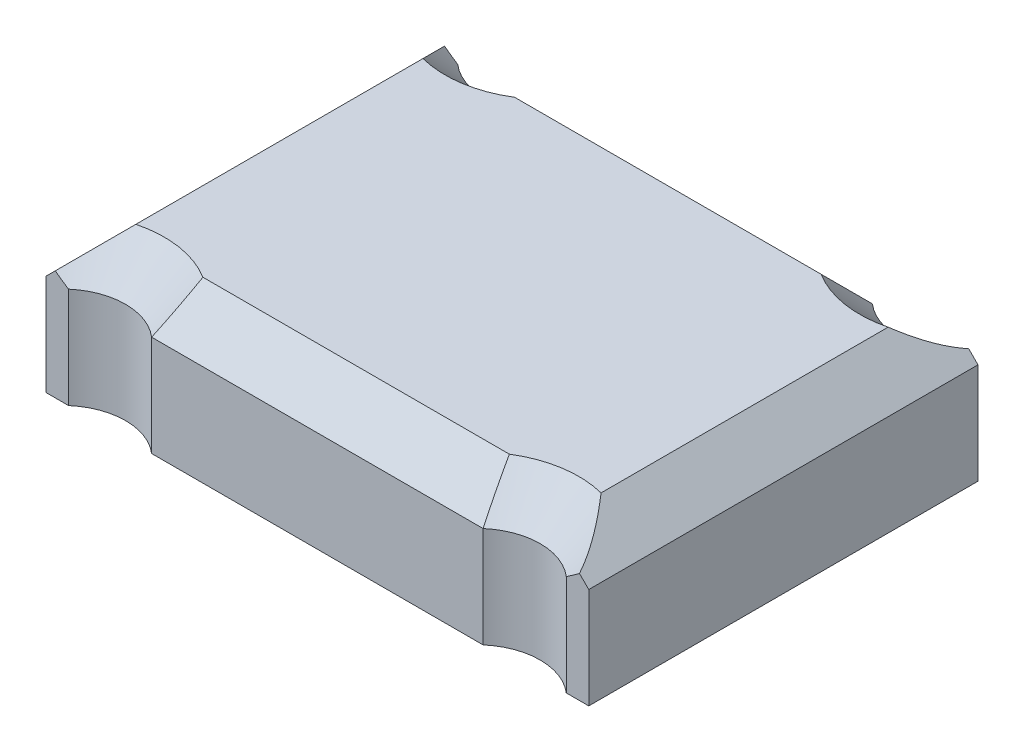
ISO-10303-21;
HEADER;
FILE_DESCRIPTION(('STEP AP214'),'2;1');
FILE_NAME('part.step','',(''),(''),'','','');
FILE_SCHEMA(('AUTOMOTIVE_DESIGN { 1 0 10303 214 1 1 1 1 }'));
ENDSEC;
DATA;
#1=APPLICATION_CONTEXT('core data for automotive mechanical design processes');
#2=APPLICATION_PROTOCOL_DEFINITION('international standard','automotive_design',2000,#1);
#3=PRODUCT_CONTEXT('',#1,'mechanical');
#4=PRODUCT('Part','Part','',(#3));
#5=PRODUCT_RELATED_PRODUCT_CATEGORY('part','',(#4));
#6=PRODUCT_DEFINITION_FORMATION('','',#4);
#7=PRODUCT_DEFINITION_CONTEXT('part definition',#1,'design');
#8=PRODUCT_DEFINITION('design','',#6,#7);
#9=PRODUCT_DEFINITION_SHAPE('','',#8);
#10=(LENGTH_UNIT() NAMED_UNIT(*) SI_UNIT(.MILLI.,.METRE.));
#11=(NAMED_UNIT(*) PLANE_ANGLE_UNIT() SI_UNIT($,.RADIAN.));
#12=(NAMED_UNIT(*) SI_UNIT($,.STERADIAN.) SOLID_ANGLE_UNIT());
#13=UNCERTAINTY_MEASURE_WITH_UNIT(LENGTH_MEASURE(1.E-05),#10,'distance_accuracy_value','');
#14=(GEOMETRIC_REPRESENTATION_CONTEXT(3) GLOBAL_UNCERTAINTY_ASSIGNED_CONTEXT((#13)) GLOBAL_UNIT_ASSIGNED_CONTEXT((#10,
#11,#12)) REPRESENTATION_CONTEXT('',''));
#15=CARTESIAN_POINT('',(0.,0.,0.));
#16=DIRECTION('',(0.,0.,1.));
#17=DIRECTION('',(1.,0.,0.));
#18=AXIS2_PLACEMENT_3D('',#15,#16,#17);
#19=CARTESIAN_POINT('',(3.5,1.8,2.51));
#20=DIRECTION('',(0.,0.,-1.));
#21=DIRECTION('',(-1.,0.,0.));
#22=AXIS2_PLACEMENT_3D('',#19,#20,#21);
#23=PLANE('',#22);
#24=DIRECTION('',(-0.707106781186546,0.707106781186549,0.));
#25=VECTOR('',#24,1.);
#26=CARTESIAN_POINT('',(3.,1.8,2.51));
#27=LINE('',#26,#25);
#28=CARTESIAN_POINT('',(3.5,1.3,2.51));
#29=VERTEX_POINT('',#28);
#30=CARTESIAN_POINT('',(3.38008862757996,1.41991137242004,2.51));
#31=VERTEX_POINT('',#30);
#32=EDGE_CURVE('E296',#29,#31,#27,.T.);
#33=ORIENTED_EDGE('',*,*,#32,.T.);
#34=CARTESIAN_POINT('',(3.5,1.51299561260159,2.51));
#35=CARTESIAN_POINT('',(3.47657078214158,1.49427418277389,2.51));
#36=CARTESIAN_POINT('',(3.45300575579374,1.47571956577469,2.51));
#37=CARTESIAN_POINT('',(3.40555023686326,1.43905917170113,2.51));
#38=CARTESIAN_POINT('',(3.38165992989963,1.4209531540066,2.51));
#39=CARTESIAN_POINT('',(3.33346993819036,1.38528106856252,2.51));
#40=CARTESIAN_POINT('',(3.30917017772385,1.36771510242035,2.51));
#41=CARTESIAN_POINT('',(3.26005914714351,1.33328559331023,2.51));
#42=CARTESIAN_POINT('',(3.23524760220719,1.31642244324374,2.51));
#43=CARTESIAN_POINT('',(3.21014025219461,1.3,2.51));
#44=B_SPLINE_CURVE_WITH_KNOTS('',3,(#34,#35,#36,#37,#38,#39,#40,#41,#42,#43),.UNSPECIFIED.,.F.,
.F.,(4,2,2,2,4),(0.,0.0899729749141632,0.179896596784228,0.269837034962367,0.359827096769237),.UNSPECIFIED.);
#45=CARTESIAN_POINT('',(3.21014025219461,1.3,2.51));
#46=VERTEX_POINT('',#45);
#47=EDGE_CURVE('E299',#31,#46,#44,.T.);
#48=ORIENTED_EDGE('',*,*,#47,.T.);
#49=DIRECTION('',(0.,-1.,0.));
#50=VECTOR('',#49,1.);
#51=CARTESIAN_POINT('',(3.21014025219461,1.8,2.51));
#52=LINE('',#51,#50);
#53=CARTESIAN_POINT('',(3.21014025219461,0.,2.51));
#54=VERTEX_POINT('',#53);
#55=EDGE_CURVE('E195',#46,#54,#52,.T.);
#56=ORIENTED_EDGE('',*,*,#55,.T.);
#57=DIRECTION('',(1.,0.,0.));
#58=VECTOR('',#57,1.);
#59=CARTESIAN_POINT('',(3.5,0.,2.51));
#60=LINE('',#59,#58);
#61=CARTESIAN_POINT('',(3.5,0.,2.51));
#62=VERTEX_POINT('',#61);
#63=EDGE_CURVE('E188',#54,#62,#60,.T.);
#64=ORIENTED_EDGE('',*,*,#63,.T.);
#65=DIRECTION('',(0.,-1.,0.));
#66=VECTOR('',#65,1.);
#67=CARTESIAN_POINT('',(3.5,1.8,2.51));
#68=LINE('',#67,#66);
#69=EDGE_CURVE('E171',#29,#62,#68,.T.);
#70=ORIENTED_EDGE('',*,*,#69,.F.);
#71=EDGE_LOOP('',(#33,#48,#56,#64,#70));
#72=FACE_BOUND('',#71,.T.);
#73=ADVANCED_FACE('F41',(#72),#23,.F.);
#74=CARTESIAN_POINT('',(3.5,1.8,-2.51));
#75=DIRECTION('',(-1.,0.,0.));
#76=DIRECTION('',(0.,0.,1.));
#77=AXIS2_PLACEMENT_3D('',#74,#75,#76);
#78=PLANE('',#77);
#79=DIRECTION('',(0.,-1.,0.));
#80=VECTOR('',#79,1.);
#81=CARTESIAN_POINT('',(3.5,1.8,-2.51));
#82=LINE('',#81,#80);
#83=CARTESIAN_POINT('',(3.5,1.3,-2.51));
#84=VERTEX_POINT('',#83);
#85=CARTESIAN_POINT('',(3.5,0.,-2.51));
#86=VERTEX_POINT('',#85);
#87=EDGE_CURVE('E182',#84,#86,#82,.T.);
#88=ORIENTED_EDGE('',*,*,#87,.F.);
#89=DIRECTION('',(0.,0.,1.));
#90=VECTOR('',#89,1.);
#91=CARTESIAN_POINT('',(3.5,1.3,2.51));
#92=LINE('',#91,#90);
#93=EDGE_CURVE('E11',#84,#29,#92,.T.);
#94=ORIENTED_EDGE('',*,*,#93,.T.);
#95=ORIENTED_EDGE('',*,*,#69,.T.);
#96=DIRECTION('',(0.,0.,-1.));
#97=VECTOR('',#96,1.);
#98=CARTESIAN_POINT('',(3.5,0.,-2.51));
#99=LINE('',#98,#97);
#100=EDGE_CURVE('E174',#62,#86,#99,.T.);
#101=ORIENTED_EDGE('',*,*,#100,.T.);
#102=EDGE_LOOP('',(#88,#94,#95,#101));
#103=FACE_BOUND('',#102,.T.);
#104=ADVANCED_FACE('F173',(#103),#78,.F.);
#105=CARTESIAN_POINT('',(3.21014025219461,1.8,-2.51));
#106=DIRECTION('',(0.,0.,1.));
#107=DIRECTION('',(1.,0.,0.));
#108=AXIS2_PLACEMENT_3D('',#105,#106,#107);
#109=PLANE('',#108);
#110=DIRECTION('',(0.,-1.,0.));
#111=VECTOR('',#110,1.);
#112=CARTESIAN_POINT('',(3.21014025219461,1.8,-2.51));
#113=LINE('',#112,#111);
#114=CARTESIAN_POINT('',(3.21014025219461,1.3,-2.51));
#115=VERTEX_POINT('',#114);
#116=CARTESIAN_POINT('',(3.21014025219461,0.,-2.51));
#117=VERTEX_POINT('',#116);
#118=EDGE_CURVE('E267',#115,#117,#113,.T.);
#119=ORIENTED_EDGE('',*,*,#118,.F.);
#120=CARTESIAN_POINT('',(3.21014025219461,1.3,-2.51));
#121=CARTESIAN_POINT('',(3.23524760220719,1.31642244324374,-2.51));
#122=CARTESIAN_POINT('',(3.26005914714351,1.33328559331023,-2.51));
#123=CARTESIAN_POINT('',(3.30917017772385,1.36771510242035,-2.51));
#124=CARTESIAN_POINT('',(3.33346993819036,1.38528106856252,-2.51));
#125=CARTESIAN_POINT('',(3.38165992989963,1.4209531540066,-2.51));
#126=CARTESIAN_POINT('',(3.40555023686326,1.43905917170113,-2.51));
#127=CARTESIAN_POINT('',(3.45300575579374,1.47571956577469,-2.51));
#128=CARTESIAN_POINT('',(3.47657078214158,1.49427418277389,-2.51));
#129=CARTESIAN_POINT('',(3.5,1.51299561260159,-2.51));
#130=B_SPLINE_CURVE_WITH_KNOTS('',3,(#120,#121,#122,#123,#124,#125,#126,#127,#128,#129),
.UNSPECIFIED.,.F.,.F.,(4,2,2,2,4),(0.,0.0899900618068701,0.179930499985009,0.269854121855073,
0.359827096769236),.UNSPECIFIED.);
#131=CARTESIAN_POINT('',(3.38008862757996,1.41991137242004,-2.51));
#132=VERTEX_POINT('',#131);
#133=EDGE_CURVE('E55',#115,#132,#130,.T.);
#134=ORIENTED_EDGE('',*,*,#133,.T.);
#135=DIRECTION('',(0.707106781186546,-0.707106781186549,0.));
#136=VECTOR('',#135,1.);
#137=CARTESIAN_POINT('',(2.99999999999999,1.8,-2.51));
#138=LINE('',#137,#136);
#139=EDGE_CURVE('E67',#132,#84,#138,.T.);
#140=ORIENTED_EDGE('',*,*,#139,.T.);
#141=ORIENTED_EDGE('',*,*,#87,.T.);
#142=DIRECTION('',(-1.,0.,0.));
#143=VECTOR('',#142,1.);
#144=CARTESIAN_POINT('',(3.21014025219461,0.,-2.51));
#145=LINE('',#144,#143);
#146=EDGE_CURVE('E191',#86,#117,#145,.T.);
#147=ORIENTED_EDGE('',*,*,#146,.T.);
#148=EDGE_LOOP('',(#119,#134,#140,#141,#147));
#149=FACE_BOUND('',#148,.T.);
#150=ADVANCED_FACE('F457',(#149),#109,.F.);
#151=CARTESIAN_POINT('',(2.67378694875179,1.8,-3.13110976423563));
#152=DIRECTION('',(0.,-1.,0.));
#153=DIRECTION('',(0.,0.,-1.));
#154=AXIS2_PLACEMENT_3D('',#151,#152,#153);
#155=CYLINDRICAL_SURFACE('',#154,0.820641337822357);
#156=DIRECTION('',(0.,-1.,0.));
#157=VECTOR('',#156,1.);
#158=CARTESIAN_POINT('',(2.13743364530897,1.8,-2.51));
#159=LINE('',#158,#157);
#160=CARTESIAN_POINT('',(2.13743364530897,1.3,-2.51));
#161=VERTEX_POINT('',#160);
#162=CARTESIAN_POINT('',(2.13743364530897,0.,-2.51));
#163=VERTEX_POINT('',#162);
#164=EDGE_CURVE('E264',#161,#163,#159,.T.);
#165=ORIENTED_EDGE('',*,*,#164,.F.);
#166=CARTESIAN_POINT('',(2.67378694875179,1.3,-3.13110976423563));
#167=DIRECTION('',(0.,1.,0.));
#168=DIRECTION('',(0.,0.,1.));
#169=AXIS2_PLACEMENT_3D('',#166,#167,#168);
#170=CIRCLE('',#169,0.820641337822357);
#171=EDGE_CURVE('E449',#161,#115,#170,.T.);
#172=ORIENTED_EDGE('',*,*,#171,.T.);
#173=ORIENTED_EDGE('',*,*,#118,.T.);
#174=CARTESIAN_POINT('',(2.67378694875179,0.,-3.13110976423563));
#175=DIRECTION('',(0.,-1.,0.));
#176=DIRECTION('',(0.,0.,-1.));
#177=AXIS2_PLACEMENT_3D('',#174,#175,#176);
#178=CIRCLE('',#177,0.820641337822357);
#179=EDGE_CURVE('E207',#117,#163,#178,.T.);
#180=ORIENTED_EDGE('',*,*,#179,.T.);
#181=EDGE_LOOP('',(#165,#172,#173,#180));
#182=FACE_BOUND('',#181,.T.);
#183=ADVANCED_FACE('F461',(#182),#155,.F.);
#184=CARTESIAN_POINT('',(-2.13743364530897,1.8,-2.51));
#185=DIRECTION('',(0.,0.,1.));
#186=DIRECTION('',(1.,0.,0.));
#187=AXIS2_PLACEMENT_3D('',#184,#185,#186);
#188=PLANE('',#187);
#189=DIRECTION('',(0.,-1.,0.));
#190=VECTOR('',#189,1.);
#191=CARTESIAN_POINT('',(-2.13743364530897,1.8,-2.51));
#192=LINE('',#191,#190);
#193=CARTESIAN_POINT('',(-2.13743364530897,1.3,-2.51));
#194=VERTEX_POINT('',#193);
#195=CARTESIAN_POINT('',(-2.13743364530897,0.,-2.51));
#196=VERTEX_POINT('',#195);
#197=EDGE_CURVE('E261',#194,#196,#192,.T.);
#198=ORIENTED_EDGE('',*,*,#197,.F.);
#199=DIRECTION('',(1.,0.,0.));
#200=VECTOR('',#199,1.);
#201=CARTESIAN_POINT('',(2.13743364530897,1.3,-2.51));
#202=LINE('',#201,#200);
#203=EDGE_CURVE('E446',#194,#161,#202,.T.);
#204=ORIENTED_EDGE('',*,*,#203,.T.);
#205=ORIENTED_EDGE('',*,*,#164,.T.);
#206=DIRECTION('',(-1.,0.,0.));
#207=VECTOR('',#206,1.);
#208=CARTESIAN_POINT('',(-2.13743364530897,0.,-2.51));
#209=LINE('',#208,#207);
#210=EDGE_CURVE('E211',#163,#196,#209,.T.);
#211=ORIENTED_EDGE('',*,*,#210,.T.);
#212=EDGE_LOOP('',(#198,#204,#205,#211));
#213=FACE_BOUND('',#212,.T.);
#214=ADVANCED_FACE('F463',(#213),#188,.F.);
#215=CARTESIAN_POINT('',(-2.67378694875179,1.8,-3.13110976423563));
#216=DIRECTION('',(0.,-1.,0.));
#217=DIRECTION('',(0.,0.,-1.));
#218=AXIS2_PLACEMENT_3D('',#215,#216,#217);
#219=CYLINDRICAL_SURFACE('',#218,0.820641337822357);
#220=DIRECTION('',(0.,-1.,0.));
#221=VECTOR('',#220,1.);
#222=CARTESIAN_POINT('',(-3.21014025219461,1.8,-2.51));
#223=LINE('',#222,#221);
#224=CARTESIAN_POINT('',(-3.21014025219461,1.3,-2.51));
#225=VERTEX_POINT('',#224);
#226=CARTESIAN_POINT('',(-3.21014025219461,0.,-2.51));
#227=VERTEX_POINT('',#226);
#228=EDGE_CURVE('E258',#225,#227,#223,.T.);
#229=ORIENTED_EDGE('',*,*,#228,.F.);
#230=CARTESIAN_POINT('',(-2.67378694875179,1.3,-3.13110976423563));
#231=DIRECTION('',(0.,1.,0.));
#232=DIRECTION('',(0.,0.,1.));
#233=AXIS2_PLACEMENT_3D('',#230,#231,#232);
#234=CIRCLE('',#233,0.820641337822357);
#235=EDGE_CURVE('E443',#225,#194,#234,.T.);
#236=ORIENTED_EDGE('',*,*,#235,.T.);
#237=ORIENTED_EDGE('',*,*,#197,.T.);
#238=CARTESIAN_POINT('',(-2.67378694875179,0.,-3.13110976423563));
#239=DIRECTION('',(0.,-1.,0.));
#240=DIRECTION('',(0.,0.,1.));
#241=AXIS2_PLACEMENT_3D('',#238,#239,#240);
#242=CIRCLE('',#241,0.820641337822357);
#243=EDGE_CURVE('E214',#196,#227,#242,.T.);
#244=ORIENTED_EDGE('',*,*,#243,.T.);
#245=EDGE_LOOP('',(#229,#236,#237,#244));
#246=FACE_BOUND('',#245,.T.);
#247=ADVANCED_FACE('F431',(#246),#219,.F.);
#248=CARTESIAN_POINT('',(-3.5,1.8,-2.51));
#249=DIRECTION('',(0.,0.,1.));
#250=DIRECTION('',(1.,0.,0.));
#251=AXIS2_PLACEMENT_3D('',#248,#249,#250);
#252=PLANE('',#251);
#253=DIRECTION('',(0.,-1.,0.));
#254=VECTOR('',#253,1.);
#255=CARTESIAN_POINT('',(-3.5,1.8,-2.51));
#256=LINE('',#255,#254);
#257=CARTESIAN_POINT('',(-3.5,1.3,-2.51));
#258=VERTEX_POINT('',#257);
#259=CARTESIAN_POINT('',(-3.5,0.,-2.51));
#260=VERTEX_POINT('',#259);
#261=EDGE_CURVE('E255',#258,#260,#256,.T.);
#262=ORIENTED_EDGE('',*,*,#261,.F.);
#263=DIRECTION('',(0.707106781186546,0.707106781186549,0.));
#264=VECTOR('',#263,1.);
#265=CARTESIAN_POINT('',(-2.99999999999999,1.8,-2.51));
#266=LINE('',#265,#264);
#267=CARTESIAN_POINT('',(-3.38008862758007,1.41991137242011,-2.51));
#268=VERTEX_POINT('',#267);
#269=EDGE_CURVE('E440',#258,#268,#266,.T.);
#270=ORIENTED_EDGE('',*,*,#269,.T.);
#271=CARTESIAN_POINT('',(-3.5,1.51299561260159,-2.51));
#272=CARTESIAN_POINT('',(-3.47657078214158,1.49427418277389,-2.51));
#273=CARTESIAN_POINT('',(-3.45300575579374,1.47571956577469,-2.51));
#274=CARTESIAN_POINT('',(-3.40555023686326,1.43905917170113,-2.51));
#275=CARTESIAN_POINT('',(-3.38165992989963,1.4209531540066,-2.51));
#276=CARTESIAN_POINT('',(-3.33346993819036,1.38528106856252,-2.51));
#277=CARTESIAN_POINT('',(-3.30917017772385,1.36771510242035,-2.51));
#278=CARTESIAN_POINT('',(-3.26005914714351,1.33328559331023,-2.51));
#279=CARTESIAN_POINT('',(-3.23524760220719,1.31642244324374,-2.51));
#280=CARTESIAN_POINT('',(-3.21014025219461,1.3,-2.51));
#281=B_SPLINE_CURVE_WITH_KNOTS('',3,(#271,#272,#273,#274,#275,#276,#277,#278,#279,#280),
.UNSPECIFIED.,.F.,.F.,(4,2,2,2,4),(0.,0.0899729749141631,0.179896596784228,0.269837034962367,
0.359827096769237),.UNSPECIFIED.);
#282=EDGE_CURVE('E434',#268,#225,#281,.T.);
#283=ORIENTED_EDGE('',*,*,#282,.T.);
#284=ORIENTED_EDGE('',*,*,#228,.T.);
#285=DIRECTION('',(-1.,0.,0.));
#286=VECTOR('',#285,1.);
#287=CARTESIAN_POINT('',(-3.5,0.,-2.51));
#288=LINE('',#287,#286);
#289=EDGE_CURVE('E218',#227,#260,#288,.T.);
#290=ORIENTED_EDGE('',*,*,#289,.T.);
#291=EDGE_LOOP('',(#262,#270,#283,#284,#290));
#292=FACE_BOUND('',#291,.T.);
#293=ADVANCED_FACE('F426',(#292),#252,.F.);
#294=CARTESIAN_POINT('',(-3.5,1.8,-2.51));
#295=DIRECTION('',(1.,0.,0.));
#296=DIRECTION('',(0.,0.,-1.));
#297=AXIS2_PLACEMENT_3D('',#294,#295,#296);
#298=PLANE('',#297);
#299=DIRECTION('',(0.,-1.,0.));
#300=VECTOR('',#299,1.);
#301=CARTESIAN_POINT('',(-3.5,1.8,2.51));
#302=LINE('',#301,#300);
#303=CARTESIAN_POINT('',(-3.5,1.3,2.51));
#304=VERTEX_POINT('',#303);
#305=CARTESIAN_POINT('',(-3.5,0.,2.51));
#306=VERTEX_POINT('',#305);
#307=EDGE_CURVE('E252',#304,#306,#302,.T.);
#308=ORIENTED_EDGE('',*,*,#307,.F.);
#309=DIRECTION('',(0.,0.,-1.));
#310=VECTOR('',#309,1.);
#311=CARTESIAN_POINT('',(-3.5,1.3,-2.51));
#312=LINE('',#311,#310);
#313=EDGE_CURVE('E400',#304,#258,#312,.T.);
#314=ORIENTED_EDGE('',*,*,#313,.T.);
#315=ORIENTED_EDGE('',*,*,#261,.T.);
#316=DIRECTION('',(0.,0.,1.));
#317=VECTOR('',#316,1.);
#318=CARTESIAN_POINT('',(-3.5,0.,-2.51));
#319=LINE('',#318,#317);
#320=EDGE_CURVE('E222',#260,#306,#319,.T.);
#321=ORIENTED_EDGE('',*,*,#320,.T.);
#322=EDGE_LOOP('',(#308,#314,#315,#321));
#323=FACE_BOUND('',#322,.T.);
#324=ADVANCED_FACE('F422',(#323),#298,.F.);
#325=CARTESIAN_POINT('',(-3.21014025219461,1.8,2.51));
#326=DIRECTION('',(0.,0.,-1.));
#327=DIRECTION('',(-1.,0.,0.));
#328=AXIS2_PLACEMENT_3D('',#325,#326,#327);
#329=PLANE('',#328);
#330=DIRECTION('',(0.,-1.,0.));
#331=VECTOR('',#330,1.);
#332=CARTESIAN_POINT('',(-3.21014025219461,1.8,2.51));
#333=LINE('',#332,#331);
#334=CARTESIAN_POINT('',(-3.21014025219461,1.3,2.51));
#335=VERTEX_POINT('',#334);
#336=CARTESIAN_POINT('',(-3.21014025219461,0.,2.51));
#337=VERTEX_POINT('',#336);
#338=EDGE_CURVE('E249',#335,#337,#333,.T.);
#339=ORIENTED_EDGE('',*,*,#338,.F.);
#340=CARTESIAN_POINT('',(-3.21014025219461,1.3,2.51));
#341=CARTESIAN_POINT('',(-3.23524760220719,1.31642244324374,2.51));
#342=CARTESIAN_POINT('',(-3.26005914714351,1.33328559331023,2.51));
#343=CARTESIAN_POINT('',(-3.30917017772385,1.36771510242035,2.51));
#344=CARTESIAN_POINT('',(-3.33346993819036,1.38528106856252,2.51));
#345=CARTESIAN_POINT('',(-3.38165992989963,1.4209531540066,2.51));
#346=CARTESIAN_POINT('',(-3.40555023686326,1.43905917170113,2.51));
#347=CARTESIAN_POINT('',(-3.45300575579374,1.47571956577469,2.51));
#348=CARTESIAN_POINT('',(-3.47657078214158,1.49427418277389,2.51));
#349=CARTESIAN_POINT('',(-3.5,1.51299561260159,2.51));
#350=B_SPLINE_CURVE_WITH_KNOTS('',3,(#340,#341,#342,#343,#344,#345,#346,#347,#348,#349),
.UNSPECIFIED.,.F.,.F.,(4,2,2,2,4),(0.,0.0899900618068701,0.179930499985009,0.269854121855073,
0.359827096769236),.UNSPECIFIED.);
#351=CARTESIAN_POINT('',(-3.38008862757996,1.41991137242004,2.51));
#352=VERTEX_POINT('',#351);
#353=EDGE_CURVE('E392',#335,#352,#350,.T.);
#354=ORIENTED_EDGE('',*,*,#353,.T.);
#355=DIRECTION('',(-0.707106781186546,-0.707106781186549,0.));
#356=VECTOR('',#355,1.);
#357=CARTESIAN_POINT('',(-3.,1.8,2.51));
#358=LINE('',#357,#356);
#359=EDGE_CURVE('E398',#352,#304,#358,.T.);
#360=ORIENTED_EDGE('',*,*,#359,.T.);
#361=ORIENTED_EDGE('',*,*,#307,.T.);
#362=DIRECTION('',(1.,0.,0.));
#363=VECTOR('',#362,1.);
#364=CARTESIAN_POINT('',(-3.21014025219461,0.,2.51));
#365=LINE('',#364,#363);
#366=EDGE_CURVE('E226',#306,#337,#365,.T.);
#367=ORIENTED_EDGE('',*,*,#366,.T.);
#368=EDGE_LOOP('',(#339,#354,#360,#361,#367));
#369=FACE_BOUND('',#368,.T.);
#370=ADVANCED_FACE('F416',(#369),#329,.F.);
#371=CARTESIAN_POINT('',(-2.67378694875179,1.8,3.13110976423563));
#372=DIRECTION('',(0.,-1.,0.));
#373=DIRECTION('',(0.,0.,-1.));
#374=AXIS2_PLACEMENT_3D('',#371,#372,#373);
#375=CYLINDRICAL_SURFACE('',#374,0.820641337822357);
#376=DIRECTION('',(0.,-1.,0.));
#377=VECTOR('',#376,1.);
#378=CARTESIAN_POINT('',(-2.13743364530897,1.8,2.51));
#379=LINE('',#378,#377);
#380=CARTESIAN_POINT('',(-2.13743364530897,1.3,2.51));
#381=VERTEX_POINT('',#380);
#382=CARTESIAN_POINT('',(-2.13743364530897,0.,2.51));
#383=VERTEX_POINT('',#382);
#384=EDGE_CURVE('E246',#381,#383,#379,.T.);
#385=ORIENTED_EDGE('',*,*,#384,.F.);
#386=CARTESIAN_POINT('',(-2.67378694875179,1.3,3.13110976423563));
#387=DIRECTION('',(0.,1.,0.));
#388=DIRECTION('',(0.,0.,1.));
#389=AXIS2_PLACEMENT_3D('',#386,#387,#388);
#390=CIRCLE('',#389,0.820641337822357);
#391=EDGE_CURVE('E403',#381,#335,#390,.T.);
#392=ORIENTED_EDGE('',*,*,#391,.T.);
#393=ORIENTED_EDGE('',*,*,#338,.T.);
#394=CARTESIAN_POINT('',(-2.67378694875179,0.,3.13110976423563));
#395=DIRECTION('',(0.,-1.,0.));
#396=DIRECTION('',(0.,0.,-1.));
#397=AXIS2_PLACEMENT_3D('',#394,#395,#396);
#398=CIRCLE('',#397,0.820641337822357);
#399=EDGE_CURVE('E230',#337,#383,#398,.T.);
#400=ORIENTED_EDGE('',*,*,#399,.T.);
#401=EDGE_LOOP('',(#385,#392,#393,#400));
#402=FACE_BOUND('',#401,.T.);
#403=ADVANCED_FACE('F421',(#402),#375,.F.);
#404=CARTESIAN_POINT('',(2.13743364530897,1.8,2.51));
#405=DIRECTION('',(0.,0.,-1.));
#406=DIRECTION('',(-1.,0.,0.));
#407=AXIS2_PLACEMENT_3D('',#404,#405,#406);
#408=PLANE('',#407);
#409=DIRECTION('',(0.,-1.,0.));
#410=VECTOR('',#409,1.);
#411=CARTESIAN_POINT('',(2.13743364530897,1.8,2.51));
#412=LINE('',#411,#410);
#413=CARTESIAN_POINT('',(2.13743364530897,1.3,2.51));
#414=VERTEX_POINT('',#413);
#415=CARTESIAN_POINT('',(2.13743364530897,0.,2.51));
#416=VERTEX_POINT('',#415);
#417=EDGE_CURVE('E243',#414,#416,#412,.T.);
#418=ORIENTED_EDGE('',*,*,#417,.F.);
#419=DIRECTION('',(-1.,0.,0.));
#420=VECTOR('',#419,1.);
#421=CARTESIAN_POINT('',(-2.13743364530897,1.3,2.51));
#422=LINE('',#421,#420);
#423=EDGE_CURVE('E408',#414,#381,#422,.T.);
#424=ORIENTED_EDGE('',*,*,#423,.T.);
#425=ORIENTED_EDGE('',*,*,#384,.T.);
#426=DIRECTION('',(1.,0.,0.));
#427=VECTOR('',#426,1.);
#428=CARTESIAN_POINT('',(2.13743364530897,0.,2.51));
#429=LINE('',#428,#427);
#430=EDGE_CURVE('E234',#383,#416,#429,.T.);
#431=ORIENTED_EDGE('',*,*,#430,.T.);
#432=EDGE_LOOP('',(#418,#424,#425,#431));
#433=FACE_BOUND('',#432,.T.);
#434=ADVANCED_FACE('F512',(#433),#408,.F.);
#435=CARTESIAN_POINT('',(2.67378694875179,1.8,3.13110976423563));
#436=DIRECTION('',(0.,-1.,0.));
#437=DIRECTION('',(0.,0.,-1.));
#438=AXIS2_PLACEMENT_3D('',#435,#436,#437);
#439=CYLINDRICAL_SURFACE('',#438,0.820641337822357);
#440=ORIENTED_EDGE('',*,*,#55,.F.);
#441=CARTESIAN_POINT('',(2.67378694875179,1.3,3.13110976423563));
#442=DIRECTION('',(0.,1.,0.));
#443=DIRECTION('',(0.,0.,1.));
#444=AXIS2_PLACEMENT_3D('',#441,#442,#443);
#445=CIRCLE('',#444,0.820641337822357);
#446=EDGE_CURVE('E307',#46,#414,#445,.T.);
#447=ORIENTED_EDGE('',*,*,#446,.T.);
#448=ORIENTED_EDGE('',*,*,#417,.T.);
#449=CARTESIAN_POINT('',(2.67378694875179,0.,3.13110976423563));
#450=DIRECTION('',(0.,-1.,0.));
#451=DIRECTION('',(0.,0.,1.));
#452=AXIS2_PLACEMENT_3D('',#449,#450,#451);
#453=CIRCLE('',#452,0.820641337822357);
#454=EDGE_CURVE('E238',#416,#54,#453,.T.);
#455=ORIENTED_EDGE('',*,*,#454,.T.);
#456=EDGE_LOOP('',(#440,#447,#448,#455));
#457=FACE_BOUND('',#456,.T.);
#458=ADVANCED_FACE('F511',(#457),#439,.F.);
#459=CARTESIAN_POINT('',(2.67378694875179,1.8,3.13110976423563));
#460=DIRECTION('',(0.,1.,0.));
#461=DIRECTION('',(0.,0.,1.));
#462=AXIS2_PLACEMENT_3D('',#459,#460,#461);
#463=PLANE('',#462);
#464=DIRECTION('',(1.,0.,0.));
#465=VECTOR('',#464,1.);
#466=CARTESIAN_POINT('',(2.13743364530897,1.8,2.01));
#467=LINE('',#466,#465);
#468=CARTESIAN_POINT('',(-1.97578520111734,1.8,2.01));
#469=VERTEX_POINT('',#468);
#470=CARTESIAN_POINT('',(1.97578520111734,1.8,2.01));
#471=VERTEX_POINT('',#470);
#472=EDGE_CURVE('E289',#469,#471,#467,.T.);
#473=ORIENTED_EDGE('',*,*,#472,.T.);
#474=CARTESIAN_POINT('',(2.67378694875179,1.8,3.13110976423563));
#475=DIRECTION('',(0.,1.,0.));
#476=DIRECTION('',(0.,0.,1.));
#477=AXIS2_PLACEMENT_3D('',#474,#475,#476);
#478=CIRCLE('',#477,1.32064133782236);
#479=CARTESIAN_POINT('',(3.,1.8,1.85139159668445));
#480=VERTEX_POINT('',#479);
#481=EDGE_CURVE('E292',#471,#480,#478,.F.);
#482=ORIENTED_EDGE('',*,*,#481,.T.);
#483=DIRECTION('',(0.,0.,-1.));
#484=VECTOR('',#483,1.);
#485=CARTESIAN_POINT('',(3.,1.8,-2.51));
#486=LINE('',#485,#484);
#487=CARTESIAN_POINT('',(3.,1.8,-1.85139159668445));
#488=VERTEX_POINT('',#487);
#489=EDGE_CURVE('E181',#480,#488,#486,.T.);
#490=ORIENTED_EDGE('',*,*,#489,.T.);
#491=CARTESIAN_POINT('',(2.67378694875179,1.8,-3.13110976423563));
#492=DIRECTION('',(0.,1.,0.));
#493=DIRECTION('',(0.,0.,1.));
#494=AXIS2_PLACEMENT_3D('',#491,#492,#493);
#495=CIRCLE('',#494,1.32064133782236);
#496=CARTESIAN_POINT('',(1.97578520111734,1.8,-2.01));
#497=VERTEX_POINT('',#496);
#498=EDGE_CURVE('E274',#488,#497,#495,.F.);
#499=ORIENTED_EDGE('',*,*,#498,.T.);
#500=DIRECTION('',(-1.,0.,0.));
#501=VECTOR('',#500,1.);
#502=CARTESIAN_POINT('',(-2.13743364530897,1.8,-2.01));
#503=LINE('',#502,#501);
#504=CARTESIAN_POINT('',(-1.97578520111734,1.8,-2.01));
#505=VERTEX_POINT('',#504);
#506=EDGE_CURVE('E277',#497,#505,#503,.T.);
#507=ORIENTED_EDGE('',*,*,#506,.T.);
#508=CARTESIAN_POINT('',(-2.67378694875179,1.8,-3.13110976423563));
#509=DIRECTION('',(0.,1.,0.));
#510=DIRECTION('',(0.,0.,1.));
#511=AXIS2_PLACEMENT_3D('',#508,#509,#510);
#512=CIRCLE('',#511,1.32064133782236);
#513=CARTESIAN_POINT('',(-3.,1.8,-1.85139159668445));
#514=VERTEX_POINT('',#513);
#515=EDGE_CURVE('E280',#505,#514,#512,.F.);
#516=ORIENTED_EDGE('',*,*,#515,.T.);
#517=DIRECTION('',(0.,0.,1.));
#518=VECTOR('',#517,1.);
#519=CARTESIAN_POINT('',(-3.,1.8,2.51));
#520=LINE('',#519,#518);
#521=CARTESIAN_POINT('',(-3.,1.8,1.85139159668445));
#522=VERTEX_POINT('',#521);
#523=EDGE_CURVE('E283',#514,#522,#520,.T.);
#524=ORIENTED_EDGE('',*,*,#523,.T.);
#525=CARTESIAN_POINT('',(-2.67378694875179,1.8,3.13110976423563));
#526=DIRECTION('',(0.,1.,0.));
#527=DIRECTION('',(0.,0.,1.));
#528=AXIS2_PLACEMENT_3D('',#525,#526,#527);
#529=CIRCLE('',#528,1.32064133782236);
#530=EDGE_CURVE('E286',#522,#469,#529,.F.);
#531=ORIENTED_EDGE('',*,*,#530,.T.);
#532=EDGE_LOOP('',(#473,#482,#490,#499,#507,#516,#524,#531));
#533=FACE_BOUND('',#532,.T.);
#534=ADVANCED_FACE('F501',(#533),#463,.T.);
#535=CARTESIAN_POINT('',(2.67378694875179,0.,3.13110976423563));
#536=DIRECTION('',(0.,1.,0.));
#537=DIRECTION('',(0.,0.,1.));
#538=AXIS2_PLACEMENT_3D('',#535,#536,#537);
#539=PLANE('',#538);
#540=ORIENTED_EDGE('',*,*,#63,.F.);
#541=ORIENTED_EDGE('',*,*,#454,.F.);
#542=ORIENTED_EDGE('',*,*,#430,.F.);
#543=ORIENTED_EDGE('',*,*,#399,.F.);
#544=ORIENTED_EDGE('',*,*,#366,.F.);
#545=ORIENTED_EDGE('',*,*,#320,.F.);
#546=ORIENTED_EDGE('',*,*,#289,.F.);
#547=ORIENTED_EDGE('',*,*,#243,.F.);
#548=ORIENTED_EDGE('',*,*,#210,.F.);
#549=ORIENTED_EDGE('',*,*,#179,.F.);
#550=ORIENTED_EDGE('',*,*,#146,.F.);
#551=ORIENTED_EDGE('',*,*,#100,.F.);
#552=EDGE_LOOP('',(#540,#541,#542,#543,#544,#545,#546,#547,#548,#549,#550,#551));
#553=FACE_BOUND('',#552,.T.);
#554=ADVANCED_FACE('F186',(#553),#539,.F.);
#555=CARTESIAN_POINT('',(-2.67378694875179,1.8,-3.13110976423563));
#556=DIRECTION('',(0.,1.,0.));
#557=DIRECTION('',(0.,0.,1.));
#558=AXIS2_PLACEMENT_3D('',#555,#556,#557);
#559=CONICAL_SURFACE('',#558,1.32064133782236,0.785398163397447);
#560=ORIENTED_EDGE('',*,*,#235,.F.);
#561=ORIENTED_EDGE('',*,*,#282,.F.);
#562=CARTESIAN_POINT('',(-0.888164953355439,3.91183504664457,-0.199651386656337));
#563=CARTESIAN_POINT('',(-0.955300753873198,3.84469924612681,-0.237371100346088));
#564=CARTESIAN_POINT('',(-1.02226231364435,3.77773768635566,-0.275713039565675));
#565=CARTESIAN_POINT('',(-1.15578577038967,3.64421422961034,-0.353788893603544));
#566=CARTESIAN_POINT('',(-1.22234762780516,3.57765237219484,-0.393522943623999));
#567=CARTESIAN_POINT('',(-1.42169411022648,3.37830588977353,-0.515241280053193));
#568=CARTESIAN_POINT('',(-1.55377782177291,3.24622217822709,-0.599540387377969));
#569=CARTESIAN_POINT('',(-1.82209038173124,2.97790961826876,-0.780365054602516));
#570=CARTESIAN_POINT('',(-1.95818490349544,2.84181509650456,-0.87729574174309));
#571=CARTESIAN_POINT('',(-2.15902921025078,2.64097078974922,-1.03106421621599));
#572=CARTESIAN_POINT('',(-2.22539300264254,2.57460699735746,-1.08368530143503));
#573=CARTESIAN_POINT('',(-2.35675505643831,2.44324494356169,-1.19222050117149));
#574=CARTESIAN_POINT('',(-2.42175349605965,2.37824650394035,-1.24813418224213));
#575=CARTESIAN_POINT('',(-2.55712779122902,2.24287220877098,-1.37028346977333));
#576=CARTESIAN_POINT('',(-2.6272995193249,2.1727004806751,-1.43697585708614));
#577=CARTESIAN_POINT('',(-2.76474758935856,2.03525241064144,-1.57631247515434));
#578=CARTESIAN_POINT('',(-2.83202114659557,1.96797885340443,-1.64896224370331));
#579=CARTESIAN_POINT('',(-2.96170716306534,1.83829283693466,-1.8008717608875));
#580=CARTESIAN_POINT('',(-3.02416107658848,1.77583892341152,-1.88005912603961));
#581=CARTESIAN_POINT('',(-3.11306267122371,1.68693732877629,-2.00549290378359));
#582=CARTESIAN_POINT('',(-3.14187746672412,1.65812253327587,-2.04837358857372));
#583=CARTESIAN_POINT('',(-3.19753192317312,1.60246807682688,-2.1366162990886));
#584=CARTESIAN_POINT('',(-3.22437138337912,1.57562861662087,-2.18197857618969));
#585=CARTESIAN_POINT('',(-3.29632258035371,1.50367741964629,-2.31328998320804));
#586=CARTESIAN_POINT('',(-3.33868946202232,1.46131053797768,-2.40243569908071));
#587=CARTESIAN_POINT('',(-3.39287431938074,1.40712568061925,-2.5430297582869));
#588=CARTESIAN_POINT('',(-3.40934504186604,1.39065495813395,-2.59091042150375));
#589=CARTESIAN_POINT('',(-3.43856532368378,1.36143467631622,-2.68887604311204));
#590=CARTESIAN_POINT('',(-3.45131789516958,1.34868210483042,-2.7389591791634));
#591=CARTESIAN_POINT('',(-3.47531653606487,1.32468346393513,-2.85484973308504));
#592=CARTESIAN_POINT('',(-3.48521403383899,1.314785966161,-2.92123518457781));
#593=CARTESIAN_POINT('',(-3.49685040693909,1.30314959306091,-3.05559728285677));
#594=CARTESIAN_POINT('',(-3.49857637003386,1.30142362996614,-3.12357627748392));
#595=CARTESIAN_POINT('',(-3.49489081106658,1.30510918893341,-3.22495132611181));
#596=CARTESIAN_POINT('',(-3.49261841689132,1.30738158310867,-3.25863251447609));
#597=CARTESIAN_POINT('',(-3.48606693483051,1.31393306516949,-3.32562006090172));
#598=CARTESIAN_POINT('',(-3.48178721937052,1.31821278062948,-3.35892629840034));
#599=CARTESIAN_POINT('',(-3.47132860483331,1.32867139516669,-3.42496596530167));
#600=CARTESIAN_POINT('',(-3.4651476762595,1.3348523237405,-3.45769874289379));
#601=CARTESIAN_POINT('',(-3.45105207506518,1.34894792493482,-3.52238151055417));
#602=CARTESIAN_POINT('',(-3.44313884543452,1.35686115456547,-3.55433212767128));
#603=CARTESIAN_POINT('',(-3.43443608917385,1.36556391082615,-3.58583234769433));
#604=B_SPLINE_CURVE_WITH_KNOTS('',3,(#562,#563,#564,#565,#566,#567,#568,#569,#570,#571,#572,
#573,#574,#575,#576,#577,#578,#579,#580,#581,#582,#583,#584,#585,#586,#587,#588,#589,#590,#591,
#592,#593,#594,#595,#596,#597,#598,#599,#600,#601,#602,#603),.UNSPECIFIED.,.F.,.F.,(4,2,2,2,2,2,
2,2,2,2,2,2,2,2,2,2,2,2,2,2,4),(0.,0.306485906527062,0.613001662012487,1.22768209150548,
1.87385434123414,2.19659426154617,2.51929179001633,2.87781497623741,3.23667529671408,
3.59199073664241,3.76934646812791,3.94672019849411,4.2673152972882,4.42680666758389,
4.58616846920592,4.78878822105575,4.9917280354095,5.09312757904537,5.19455884566532,
5.29609876556212,5.3975544233806),.UNSPECIFIED.);
#605=EDGE_CURVE('E46',#514,#268,#604,.T.);
#606=ORIENTED_EDGE('',*,*,#605,.F.);
#607=ORIENTED_EDGE('',*,*,#515,.F.);
#608=CARTESIAN_POINT('',(-2.13743364530897,1.3,-2.51));
#609=CARTESIAN_POINT('',(-2.12206388753442,1.34135142841689,-2.46864857158311));
#610=CARTESIAN_POINT('',(-2.10728762310297,1.38281038511326,-2.42718961488674));
#611=CARTESIAN_POINT('',(-2.07873756689896,1.46589202999174,-2.34410797000825));
#612=CARTESIAN_POINT('',(-2.06496357254419,1.5075146832842,-2.3024853167158));
#613=CARTESIAN_POINT('',(-2.03822897170406,1.59088449195511,-2.21911550804489));
#614=CARTESIAN_POINT('',(-2.02526827365012,1.63263163276117,-2.17736836723883));
#615=CARTESIAN_POINT('',(-2.00003753867864,1.71623910290132,-2.09376089709868));
#616=CARTESIAN_POINT('',(-1.98776764138827,1.75809945333854,-2.05190054666146));
#617=CARTESIAN_POINT('',(-1.97578520111734,1.8,-2.01));
#618=B_SPLINE_CURVE_WITH_KNOTS('',3,(#608,#609,#610,#611,#612,#613,#614,#615,#616,#617),
.UNSPECIFIED.,.F.,.F.,(4,2,2,2,4),(0.,0.181388803876476,0.362740842403016,0.544072425834777,
0.72544053005008),.UNSPECIFIED.);
#619=EDGE_CURVE('E203',#194,#505,#618,.T.);
#620=ORIENTED_EDGE('',*,*,#619,.F.);
#621=EDGE_LOOP('',(#560,#561,#606,#607,#620));
#622=FACE_BOUND('',#621,.T.);
#623=ADVANCED_FACE('F43',(#622),#559,.F.);
#624=CARTESIAN_POINT('',(-3.,1.8,3.13110976423563));
#625=DIRECTION('',(-0.707106781186549,0.707106781186546,0.));
#626=DIRECTION('',(0.,0.,-1.));
#627=AXIS2_PLACEMENT_3D('',#624,#625,#626);
#628=PLANE('',#627);
#629=ORIENTED_EDGE('',*,*,#313,.F.);
#630=ORIENTED_EDGE('',*,*,#359,.F.);
#631=CARTESIAN_POINT('',(-0.88816495335544,3.91183504664457,0.199651386656339));
#632=CARTESIAN_POINT('',(-0.955300753873198,3.84469924612681,0.237371100346089));
#633=CARTESIAN_POINT('',(-1.02226231364435,3.77773768635566,0.275713039565677));
#634=CARTESIAN_POINT('',(-1.15578577038967,3.64421422961034,0.353788893603545));
#635=CARTESIAN_POINT('',(-1.22234762780516,3.57765237219484,0.393522943624));
#636=CARTESIAN_POINT('',(-1.42169411022648,3.37830588977353,0.515241280053194));
#637=CARTESIAN_POINT('',(-1.55377782177291,3.24622217822709,0.59954038737797));
#638=CARTESIAN_POINT('',(-1.82209038173124,2.97790961826876,0.780365054602518));
#639=CARTESIAN_POINT('',(-1.95818490349544,2.84181509650456,0.877295741743091));
#640=CARTESIAN_POINT('',(-2.15902921025078,2.64097078974922,1.03106421621599));
#641=CARTESIAN_POINT('',(-2.22539300264254,2.57460699735746,1.08368530143503));
#642=CARTESIAN_POINT('',(-2.35675505643831,2.44324494356169,1.19222050117149));
#643=CARTESIAN_POINT('',(-2.42175349605965,2.37824650394035,1.24813418224213));
#644=CARTESIAN_POINT('',(-2.55712779122902,2.24287220877098,1.37028346977333));
#645=CARTESIAN_POINT('',(-2.6272995193249,2.1727004806751,1.43697585708614));
#646=CARTESIAN_POINT('',(-2.76474758935856,2.03525241064143,1.57631247515435));
#647=CARTESIAN_POINT('',(-2.83202114659557,1.96797885340442,1.64896224370331));
#648=CARTESIAN_POINT('',(-2.96170716306534,1.83829283693466,1.8008717608875));
#649=CARTESIAN_POINT('',(-3.02416107658848,1.77583892341152,1.88005912603961));
#650=CARTESIAN_POINT('',(-3.11306267122371,1.68693732877629,2.0054929037836));
#651=CARTESIAN_POINT('',(-3.14187746672412,1.65812253327587,2.04837358857372));
#652=CARTESIAN_POINT('',(-3.19753192317311,1.60246807682688,2.13661629908861));
#653=CARTESIAN_POINT('',(-3.22437138337912,1.57562861662087,2.18197857618969));
#654=CARTESIAN_POINT('',(-3.29632258035371,1.50367741964629,2.31328998320804));
#655=CARTESIAN_POINT('',(-3.33868946202232,1.46131053797768,2.40243569908071));
#656=CARTESIAN_POINT('',(-3.39287431938074,1.40712568061925,2.5430297582869));
#657=CARTESIAN_POINT('',(-3.40934504186604,1.39065495813395,2.59091042150375));
#658=CARTESIAN_POINT('',(-3.43856532368378,1.36143467631622,2.68887604311204));
#659=CARTESIAN_POINT('',(-3.45131789516958,1.34868210483042,2.7389591791634));
#660=CARTESIAN_POINT('',(-3.47531653606487,1.32468346393513,2.85484973308504));
#661=CARTESIAN_POINT('',(-3.48521403383899,1.314785966161,2.92123518457781));
#662=CARTESIAN_POINT('',(-3.49685040693909,1.30314959306091,3.05559728285677));
#663=CARTESIAN_POINT('',(-3.49857637003386,1.30142362996614,3.12357627748392));
#664=CARTESIAN_POINT('',(-3.49489081106658,1.30510918893341,3.22495132611181));
#665=CARTESIAN_POINT('',(-3.49261841689132,1.30738158310867,3.25863251447608));
#666=CARTESIAN_POINT('',(-3.48606693483051,1.31393306516949,3.32562006090172));
#667=CARTESIAN_POINT('',(-3.48178721937052,1.31821278062947,3.35892629840034));
#668=CARTESIAN_POINT('',(-3.47132860483331,1.32867139516668,3.42496596530167));
#669=CARTESIAN_POINT('',(-3.4651476762595,1.3348523237405,3.45769874289379));
#670=CARTESIAN_POINT('',(-3.45105207506518,1.34894792493481,3.52238151055417));
#671=CARTESIAN_POINT('',(-3.44313884543452,1.35686115456547,3.55433212767128));
#672=CARTESIAN_POINT('',(-3.43443608917385,1.36556391082615,3.58583234769433));
#673=B_SPLINE_CURVE_WITH_KNOTS('',3,(#631,#632,#633,#634,#635,#636,#637,#638,#639,#640,#641,
#642,#643,#644,#645,#646,#647,#648,#649,#650,#651,#652,#653,#654,#655,#656,#657,#658,#659,#660,
#661,#662,#663,#664,#665,#666,#667,#668,#669,#670,#671,#672),.UNSPECIFIED.,.F.,.F.,(4,2,2,2,2,2,
2,2,2,2,2,2,2,2,2,2,2,2,2,2,4),(0.,0.306485906527062,0.613001662012487,1.22768209150548,
1.87385434123413,2.19659426154617,2.51929179001633,2.87781497623741,3.23667529671408,
3.5919907366424,3.76934646812791,3.94672019849411,4.2673152972882,4.42680666758389,
4.58616846920591,4.78878822105574,4.9917280354095,5.09312757904537,5.19455884566531,
5.29609876556211,5.39755442338059),.UNSPECIFIED.);
#674=EDGE_CURVE('E365',#522,#352,#673,.T.);
#675=ORIENTED_EDGE('',*,*,#674,.F.);
#676=ORIENTED_EDGE('',*,*,#523,.F.);
#677=ORIENTED_EDGE('',*,*,#605,.T.);
#678=ORIENTED_EDGE('',*,*,#269,.F.);
#679=EDGE_LOOP('',(#629,#630,#675,#676,#677,#678));
#680=FACE_BOUND('',#679,.T.);
#681=ADVANCED_FACE('F372',(#680),#628,.T.);
#682=CARTESIAN_POINT('',(2.67378694875179,1.8,-2.01));
#683=DIRECTION('',(0.,0.707106781186546,-0.707106781186549));
#684=DIRECTION('',(1.,0.,0.));
#685=AXIS2_PLACEMENT_3D('',#682,#683,#684);
#686=PLANE('',#685);
#687=ORIENTED_EDGE('',*,*,#619,.T.);
#688=ORIENTED_EDGE('',*,*,#506,.F.);
#689=CARTESIAN_POINT('',(2.13743364530897,1.3,-2.51));
#690=CARTESIAN_POINT('',(2.12206388753443,1.34135142841689,-2.46864857158311));
#691=CARTESIAN_POINT('',(2.10728762310297,1.38281038511326,-2.42718961488674));
#692=CARTESIAN_POINT('',(2.07873756689896,1.46589202999174,-2.34410797000825));
#693=CARTESIAN_POINT('',(2.06496357254419,1.5075146832842,-2.3024853167158));
#694=CARTESIAN_POINT('',(2.03822897170406,1.59088449195511,-2.21911550804489));
#695=CARTESIAN_POINT('',(2.02526827365012,1.63263163276117,-2.17736836723882));
#696=CARTESIAN_POINT('',(2.00003753867864,1.71623910290132,-2.09376089709868));
#697=CARTESIAN_POINT('',(1.98776764138827,1.75809945333854,-2.05190054666146));
#698=CARTESIAN_POINT('',(1.97578520111734,1.8,-2.01));
#699=B_SPLINE_CURVE_WITH_KNOTS('',3,(#689,#690,#691,#692,#693,#694,#695,#696,#697,#698),
.UNSPECIFIED.,.F.,.F.,(4,2,2,2,4),(0.,0.181388803876477,0.362740842403017,0.544072425834777,
0.72544053005008),.UNSPECIFIED.);
#700=EDGE_CURVE('E358',#161,#497,#699,.T.);
#701=ORIENTED_EDGE('',*,*,#700,.F.);
#702=ORIENTED_EDGE('',*,*,#203,.F.);
#703=EDGE_LOOP('',(#687,#688,#701,#702));
#704=FACE_BOUND('',#703,.T.);
#705=ADVANCED_FACE('F369',(#704),#686,.T.);
#706=CARTESIAN_POINT('',(-2.67378694875179,1.8,3.13110976423563));
#707=DIRECTION('',(0.,1.,0.));
#708=DIRECTION('',(0.,0.,1.));
#709=AXIS2_PLACEMENT_3D('',#706,#707,#708);
#710=CONICAL_SURFACE('',#709,1.32064133782236,0.785398163397447);
#711=ORIENTED_EDGE('',*,*,#353,.F.);
#712=ORIENTED_EDGE('',*,*,#391,.F.);
#713=CARTESIAN_POINT('',(-2.13743364530897,1.3,2.51));
#714=CARTESIAN_POINT('',(-2.12206388753443,1.34135142841689,2.46864857158311));
#715=CARTESIAN_POINT('',(-2.10728762310297,1.38281038511326,2.42718961488674));
#716=CARTESIAN_POINT('',(-2.07873756689896,1.46589202999174,2.34410797000825));
#717=CARTESIAN_POINT('',(-2.06496357254419,1.5075146832842,2.3024853167158));
#718=CARTESIAN_POINT('',(-2.03822897170406,1.59088449195511,2.21911550804489));
#719=CARTESIAN_POINT('',(-2.02526827365012,1.63263163276117,2.17736836723883));
#720=CARTESIAN_POINT('',(-2.00003753867864,1.71623910290132,2.09376089709868));
#721=CARTESIAN_POINT('',(-1.98776764138827,1.75809945333854,2.05190054666146));
#722=CARTESIAN_POINT('',(-1.97578520111734,1.8,2.01));
#723=B_SPLINE_CURVE_WITH_KNOTS('',3,(#713,#714,#715,#716,#717,#718,#719,#720,#721,#722),
.UNSPECIFIED.,.F.,.F.,(4,2,2,2,4),(0.,0.181388803876477,0.362740842403017,0.544072425834777,
0.72544053005008),.UNSPECIFIED.);
#724=EDGE_CURVE('E337',#469,#381,#723,.F.);
#725=ORIENTED_EDGE('',*,*,#724,.F.);
#726=ORIENTED_EDGE('',*,*,#530,.F.);
#727=ORIENTED_EDGE('',*,*,#674,.T.);
#728=EDGE_LOOP('',(#711,#712,#725,#726,#727));
#729=FACE_BOUND('',#728,.T.);
#730=ADVANCED_FACE('F350',(#729),#710,.F.);
#731=CARTESIAN_POINT('',(2.67378694875179,1.8,-3.13110976423563));
#732=DIRECTION('',(0.,1.,0.));
#733=DIRECTION('',(0.,0.,1.));
#734=AXIS2_PLACEMENT_3D('',#731,#732,#733);
#735=CONICAL_SURFACE('',#734,1.32064133782236,0.785398163397447);
#736=ORIENTED_EDGE('',*,*,#700,.T.);
#737=ORIENTED_EDGE('',*,*,#498,.F.);
#738=CARTESIAN_POINT('',(0.888164953355438,3.91183504664457,-0.199651386656338));
#739=CARTESIAN_POINT('',(0.955300753873197,3.84469924612681,-0.237371100346089));
#740=CARTESIAN_POINT('',(1.02226231364435,3.77773768635566,-0.275713039565677));
#741=CARTESIAN_POINT('',(1.15578577038967,3.64421422961034,-0.353788893603545));
#742=CARTESIAN_POINT('',(1.22234762780516,3.57765237219484,-0.393522943624));
#743=CARTESIAN_POINT('',(1.42169411022648,3.37830588977353,-0.515241280053194));
#744=CARTESIAN_POINT('',(1.55377782177291,3.24622217822709,-0.59954038737797));
#745=CARTESIAN_POINT('',(1.82209038173124,2.97790961826876,-0.780365054602517));
#746=CARTESIAN_POINT('',(1.95818490349544,2.84181509650456,-0.877295741743091));
#747=CARTESIAN_POINT('',(2.15902921025078,2.64097078974922,-1.03106421621599));
#748=CARTESIAN_POINT('',(2.22539300264254,2.57460699735746,-1.08368530143503));
#749=CARTESIAN_POINT('',(2.35675505643831,2.44324494356169,-1.19222050117149));
#750=CARTESIAN_POINT('',(2.42175349605965,2.37824650394035,-1.24813418224213));
#751=CARTESIAN_POINT('',(2.55712779122902,2.24287220877098,-1.37028346977333));
#752=CARTESIAN_POINT('',(2.6272995193249,2.1727004806751,-1.43697585708614));
#753=CARTESIAN_POINT('',(2.76474758935856,2.03525241064143,-1.57631247515435));
#754=CARTESIAN_POINT('',(2.83202114659557,1.96797885340442,-1.64896224370331));
#755=CARTESIAN_POINT('',(2.96170716306534,1.83829283693466,-1.8008717608875));
#756=CARTESIAN_POINT('',(3.02416107658848,1.77583892341152,-1.88005912603961));
#757=CARTESIAN_POINT('',(3.11306267122371,1.68693732877629,-2.00549290378359));
#758=CARTESIAN_POINT('',(3.14187746672412,1.65812253327587,-2.04837358857372));
#759=CARTESIAN_POINT('',(3.19753192317311,1.60246807682688,-2.1366162990886));
#760=CARTESIAN_POINT('',(3.22437138337912,1.57562861662087,-2.18197857618969));
#761=CARTESIAN_POINT('',(3.29632258035371,1.50367741964629,-2.31328998320804));
#762=CARTESIAN_POINT('',(3.33868946202232,1.46131053797768,-2.40243569908071));
#763=CARTESIAN_POINT('',(3.39287431938074,1.40712568061926,-2.5430297582869));
#764=CARTESIAN_POINT('',(3.40934504186604,1.39065495813395,-2.59091042150375));
#765=CARTESIAN_POINT('',(3.43856532368378,1.36143467631622,-2.68887604311204));
#766=CARTESIAN_POINT('',(3.45131789516957,1.34868210483042,-2.7389591791634));
#767=CARTESIAN_POINT('',(3.47531653606487,1.32468346393513,-2.85484973308504));
#768=CARTESIAN_POINT('',(3.48521403383899,1.314785966161,-2.92123518457781));
#769=CARTESIAN_POINT('',(3.49685040693909,1.30314959306091,-3.05559728285677));
#770=CARTESIAN_POINT('',(3.49857637003386,1.30142362996614,-3.12357627748392));
#771=CARTESIAN_POINT('',(3.49489081106658,1.30510918893341,-3.22495132611181));
#772=CARTESIAN_POINT('',(3.49261841689132,1.30738158310867,-3.25863251447608));
#773=CARTESIAN_POINT('',(3.48606693483051,1.31393306516949,-3.32562006090172));
#774=CARTESIAN_POINT('',(3.48178721937052,1.31821278062947,-3.35892629840034));
#775=CARTESIAN_POINT('',(3.47132860483331,1.32867139516668,-3.42496596530167));
#776=CARTESIAN_POINT('',(3.4651476762595,1.3348523237405,-3.45769874289379));
#777=CARTESIAN_POINT('',(3.45105207506518,1.34894792493481,-3.52238151055417));
#778=CARTESIAN_POINT('',(3.44313884543452,1.35686115456547,-3.55433212767127));
#779=CARTESIAN_POINT('',(3.43443608917385,1.36556391082615,-3.58583234769433));
#780=B_SPLINE_CURVE_WITH_KNOTS('',3,(#738,#739,#740,#741,#742,#743,#744,#745,#746,#747,#748,
#749,#750,#751,#752,#753,#754,#755,#756,#757,#758,#759,#760,#761,#762,#763,#764,#765,#766,#767,
#768,#769,#770,#771,#772,#773,#774,#775,#776,#777,#778,#779),.UNSPECIFIED.,.F.,.F.,(4,2,2,2,2,2,
2,2,2,2,2,2,2,2,2,2,2,2,2,2,4),(0.,0.306485906527063,0.613001662012488,1.22768209150548,
1.87385434123414,2.19659426154617,2.51929179001634,2.87781497623741,3.23667529671408,
3.5919907366424,3.76934646812791,3.94672019849411,4.2673152972882,4.42680666758389,
4.58616846920591,4.78878822105574,4.9917280354095,5.09312757904537,5.19455884566532,
5.29609876556211,5.39755442338059),.UNSPECIFIED.);
#781=EDGE_CURVE('E330',#132,#488,#780,.F.);
#782=ORIENTED_EDGE('',*,*,#781,.F.);
#783=ORIENTED_EDGE('',*,*,#133,.F.);
#784=ORIENTED_EDGE('',*,*,#171,.F.);
#785=EDGE_LOOP('',(#736,#737,#782,#783,#784));
#786=FACE_BOUND('',#785,.T.);
#787=ADVANCED_FACE('F347',(#786),#735,.F.);
#788=CARTESIAN_POINT('',(2.67378694875179,1.8,2.01));
#789=DIRECTION('',(0.,0.707106781186546,0.707106781186549));
#790=DIRECTION('',(-1.,0.,0.));
#791=AXIS2_PLACEMENT_3D('',#788,#789,#790);
#792=PLANE('',#791);
#793=ORIENTED_EDGE('',*,*,#724,.T.);
#794=ORIENTED_EDGE('',*,*,#423,.F.);
#795=CARTESIAN_POINT('',(2.13743364530897,1.3,2.51));
#796=CARTESIAN_POINT('',(2.12206388753442,1.34135142841689,2.46864857158311));
#797=CARTESIAN_POINT('',(2.10728762310297,1.38281038511326,2.42718961488674));
#798=CARTESIAN_POINT('',(2.07873756689896,1.46589202999174,2.34410797000825));
#799=CARTESIAN_POINT('',(2.06496357254419,1.5075146832842,2.3024853167158));
#800=CARTESIAN_POINT('',(2.03822897170406,1.59088449195511,2.21911550804489));
#801=CARTESIAN_POINT('',(2.02526827365012,1.63263163276117,2.17736836723883));
#802=CARTESIAN_POINT('',(2.00003753867864,1.71623910290132,2.09376089709868));
#803=CARTESIAN_POINT('',(1.98776764138827,1.75809945333854,2.05190054666146));
#804=CARTESIAN_POINT('',(1.97578520111734,1.8,2.01));
#805=B_SPLINE_CURVE_WITH_KNOTS('',3,(#795,#796,#797,#798,#799,#800,#801,#802,#803,#804),
.UNSPECIFIED.,.F.,.F.,(4,2,2,2,4),(0.,0.181388803876476,0.362740842403016,0.544072425834777,
0.72544053005008),.UNSPECIFIED.);
#806=EDGE_CURVE('E338',#471,#414,#805,.F.);
#807=ORIENTED_EDGE('',*,*,#806,.F.);
#808=ORIENTED_EDGE('',*,*,#472,.F.);
#809=EDGE_LOOP('',(#793,#794,#807,#808));
#810=FACE_BOUND('',#809,.T.);
#811=ADVANCED_FACE('F320',(#810),#792,.T.);
#812=CARTESIAN_POINT('',(3.,1.8,3.13110976423563));
#813=DIRECTION('',(0.707106781186549,0.707106781186546,0.));
#814=DIRECTION('',(0.,0.,1.));
#815=AXIS2_PLACEMENT_3D('',#812,#813,#814);
#816=PLANE('',#815);
#817=ORIENTED_EDGE('',*,*,#781,.T.);
#818=ORIENTED_EDGE('',*,*,#489,.F.);
#819=CARTESIAN_POINT('',(0.888164953355441,3.91183504664456,0.19965138665634));
#820=CARTESIAN_POINT('',(0.9553007538732,3.84469924612681,0.237371100346091));
#821=CARTESIAN_POINT('',(1.02226231364435,3.77773768635566,0.275713039565679));
#822=CARTESIAN_POINT('',(1.15578577038967,3.64421422961034,0.353788893603547));
#823=CARTESIAN_POINT('',(1.22234762780516,3.57765237219484,0.393522943624002));
#824=CARTESIAN_POINT('',(1.42169411022648,3.37830588977352,0.515241280053196));
#825=CARTESIAN_POINT('',(1.55377782177291,3.24622217822709,0.599540387377972));
#826=CARTESIAN_POINT('',(1.82209038173125,2.97790961826876,0.780365054602519));
#827=CARTESIAN_POINT('',(1.95818490349544,2.84181509650456,0.877295741743092));
#828=CARTESIAN_POINT('',(2.15902921025078,2.64097078974922,1.03106421621599));
#829=CARTESIAN_POINT('',(2.22539300264255,2.57460699735746,1.08368530143503));
#830=CARTESIAN_POINT('',(2.35675505643831,2.44324494356169,1.19222050117149));
#831=CARTESIAN_POINT('',(2.42175349605965,2.37824650394035,1.24813418224213));
#832=CARTESIAN_POINT('',(2.55712779122902,2.24287220877098,1.37028346977333));
#833=CARTESIAN_POINT('',(2.6272995193249,2.1727004806751,1.43697585708614));
#834=CARTESIAN_POINT('',(2.76474758935857,2.03525241064143,1.57631247515435));
#835=CARTESIAN_POINT('',(2.83202114659558,1.96797885340442,1.64896224370331));
#836=CARTESIAN_POINT('',(2.96170716306534,1.83829283693466,1.8008717608875));
#837=CARTESIAN_POINT('',(3.02416107658848,1.77583892341152,1.88005912603961));
#838=CARTESIAN_POINT('',(3.11306267122371,1.68693732877629,2.0054929037836));
#839=CARTESIAN_POINT('',(3.14187746672412,1.65812253327587,2.04837358857372));
#840=CARTESIAN_POINT('',(3.19753192317312,1.60246807682688,2.13661629908861));
#841=CARTESIAN_POINT('',(3.22437138337912,1.57562861662087,2.18197857618969));
#842=CARTESIAN_POINT('',(3.29632258035371,1.50367741964629,2.31328998320804));
#843=CARTESIAN_POINT('',(3.33868946202232,1.46131053797768,2.40243569908071));
#844=CARTESIAN_POINT('',(3.39287431938074,1.40712568061926,2.5430297582869));
#845=CARTESIAN_POINT('',(3.40934504186604,1.39065495813395,2.59091042150375));
#846=CARTESIAN_POINT('',(3.43856532368378,1.36143467631622,2.68887604311204));
#847=CARTESIAN_POINT('',(3.45131789516958,1.34868210483042,2.7389591791634));
#848=CARTESIAN_POINT('',(3.47531653606487,1.32468346393513,2.85484973308504));
#849=CARTESIAN_POINT('',(3.48521403383899,1.314785966161,2.92123518457781));
#850=CARTESIAN_POINT('',(3.49685040693909,1.30314959306091,3.05559728285677));
#851=CARTESIAN_POINT('',(3.49857637003386,1.30142362996614,3.12357627748392));
#852=CARTESIAN_POINT('',(3.49489081106658,1.30510918893341,3.22495132611181));
#853=CARTESIAN_POINT('',(3.49261841689132,1.30738158310867,3.25863251447609));
#854=CARTESIAN_POINT('',(3.48606693483051,1.31393306516949,3.32562006090172));
#855=CARTESIAN_POINT('',(3.48178721937052,1.31821278062948,3.35892629840034));
#856=CARTESIAN_POINT('',(3.47132860483331,1.32867139516669,3.42496596530167));
#857=CARTESIAN_POINT('',(3.4651476762595,1.3348523237405,3.45769874289379));
#858=CARTESIAN_POINT('',(3.45105207506518,1.34894792493482,3.52238151055417));
#859=CARTESIAN_POINT('',(3.44313884543452,1.35686115456547,3.55433212767128));
#860=CARTESIAN_POINT('',(3.43443608917385,1.36556391082615,3.58583234769433));
#861=B_SPLINE_CURVE_WITH_KNOTS('',3,(#819,#820,#821,#822,#823,#824,#825,#826,#827,#828,#829,
#830,#831,#832,#833,#834,#835,#836,#837,#838,#839,#840,#841,#842,#843,#844,#845,#846,#847,#848,
#849,#850,#851,#852,#853,#854,#855,#856,#857,#858,#859,#860),.UNSPECIFIED.,.F.,.F.,(4,2,2,2,2,2,
2,2,2,2,2,2,2,2,2,2,2,2,2,2,4),(0.,0.306485906527062,0.613001662012487,1.22768209150548,
1.87385434123413,2.19659426154617,2.51929179001633,2.87781497623741,3.23667529671407,
3.5919907366424,3.7693464681279,3.9467201984941,4.2673152972882,4.42680666758389,
4.58616846920591,4.78878822105574,4.9917280354095,5.09312757904537,5.19455884566531,
5.29609876556211,5.39755442338059),.UNSPECIFIED.);
#862=EDGE_CURVE('E324',#31,#480,#861,.F.);
#863=ORIENTED_EDGE('',*,*,#862,.F.);
#864=ORIENTED_EDGE('',*,*,#32,.F.);
#865=ORIENTED_EDGE('',*,*,#93,.F.);
#866=ORIENTED_EDGE('',*,*,#139,.F.);
#867=EDGE_LOOP('',(#817,#818,#863,#864,#865,#866));
#868=FACE_BOUND('',#867,.T.);
#869=ADVANCED_FACE('F317',(#868),#816,.T.);
#870=CARTESIAN_POINT('',(2.67378694875179,1.8,3.13110976423563));
#871=DIRECTION('',(0.,1.,0.));
#872=DIRECTION('',(0.,0.,1.));
#873=AXIS2_PLACEMENT_3D('',#870,#871,#872);
#874=CONICAL_SURFACE('',#873,1.32064133782236,0.785398163397447);
#875=ORIENTED_EDGE('',*,*,#806,.T.);
#876=ORIENTED_EDGE('',*,*,#446,.F.);
#877=ORIENTED_EDGE('',*,*,#47,.F.);
#878=ORIENTED_EDGE('',*,*,#862,.T.);
#879=ORIENTED_EDGE('',*,*,#481,.F.);
#880=EDGE_LOOP('',(#875,#876,#877,#878,#879));
#881=FACE_BOUND('',#880,.T.);
#882=ADVANCED_FACE('F309',(#881),#874,.F.);
#883=CLOSED_SHELL('',(#73,#104,#150,#183,#214,#247,#293,#324,#370,#403,#434,#458,#534,#554,#623,
#681,#705,#730,#787,#811,#869,#882));
#884=MANIFOLD_SOLID_BREP('B2',#883);
#885=ADVANCED_BREP_SHAPE_REPRESENTATION('',(#18,#884),#14);
#886=SHAPE_DEFINITION_REPRESENTATION(#9,#885);
ENDSEC;
END-ISO-10303-21;
